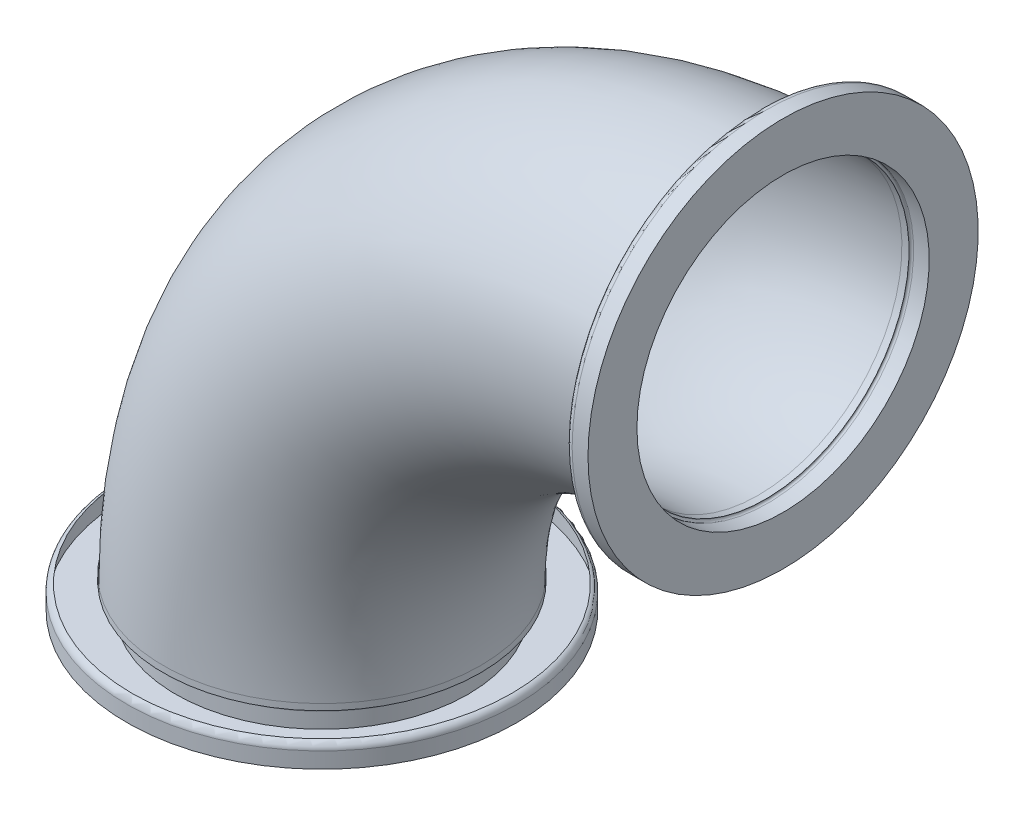
ISO-10303-21;
HEADER;
FILE_DESCRIPTION(('STEP AP214'),'2;1');
FILE_NAME('part.step','',(''),(''),'','','');
FILE_SCHEMA(('AUTOMOTIVE_DESIGN { 1 0 10303 214 1 1 1 1 }'));
ENDSEC;
DATA;
#1=APPLICATION_CONTEXT('core data for automotive mechanical design processes');
#2=APPLICATION_PROTOCOL_DEFINITION('international standard','automotive_design',2000,#1);
#3=PRODUCT_CONTEXT('',#1,'mechanical');
#4=PRODUCT('Part','Part','',(#3));
#5=PRODUCT_RELATED_PRODUCT_CATEGORY('part','',(#4));
#6=PRODUCT_DEFINITION_FORMATION('','',#4);
#7=PRODUCT_DEFINITION_CONTEXT('part definition',#1,'design');
#8=PRODUCT_DEFINITION('design','',#6,#7);
#9=PRODUCT_DEFINITION_SHAPE('','',#8);
#10=(LENGTH_UNIT() NAMED_UNIT(*) SI_UNIT(.MILLI.,.METRE.));
#11=(NAMED_UNIT(*) PLANE_ANGLE_UNIT() SI_UNIT($,.RADIAN.));
#12=(NAMED_UNIT(*) SI_UNIT($,.STERADIAN.) SOLID_ANGLE_UNIT());
#13=UNCERTAINTY_MEASURE_WITH_UNIT(LENGTH_MEASURE(1.E-05),#10,'distance_accuracy_value','');
#14=(GEOMETRIC_REPRESENTATION_CONTEXT(3) GLOBAL_UNCERTAINTY_ASSIGNED_CONTEXT((#13)) GLOBAL_UNIT_ASSIGNED_CONTEXT((#10,
#11,#12)) REPRESENTATION_CONTEXT('',''));
#15=CARTESIAN_POINT('',(0.,0.,0.));
#16=DIRECTION('',(0.,0.,1.));
#17=DIRECTION('',(1.,0.,0.));
#18=AXIS2_PLACEMENT_3D('',#15,#16,#17);
#19=CARTESIAN_POINT('',(-2.35922392732846E-13,61.5,0.));
#20=DIRECTION('',(1.,0.,0.));
#21=DIRECTION('',(0.,1.,0.));
#22=AXIS2_PLACEMENT_3D('',#19,#20,#21);
#23=PLANE('',#22);
#24=CARTESIAN_POINT('',(-2.35913423356498E-13,61.5,0.));
#25=DIRECTION('',(1.,0.,0.));
#26=DIRECTION('',(0.,0.,1.));
#27=AXIS2_PLACEMENT_3D('',#24,#25,#26);
#28=CIRCLE('',#27,22.25);
#29=CARTESIAN_POINT('',(-1.50562631979554E-13,39.25,0.));
#30=VERTEX_POINT('',#29);
#31=EDGE_CURVE('E123',#30,#30,#28,.T.);
#32=ORIENTED_EDGE('',*,*,#31,.T.);
#33=EDGE_LOOP('',(#32));
#34=FACE_BOUND('',#33,.T.);
#35=CARTESIAN_POINT('',(-2.35922392732846E-13,61.5,0.));
#36=DIRECTION('',(1.,0.,0.));
#37=DIRECTION('',(0.,0.,-1.));
#38=AXIS2_PLACEMENT_3D('',#35,#36,#37);
#39=CIRCLE('',#38,22.35);
#40=CARTESIAN_POINT('',(-2.35922392732846E-13,61.5,22.35));
#41=VERTEX_POINT('',#40);
#42=EDGE_CURVE('E203',#41,#41,#39,.T.);
#43=ORIENTED_EDGE('',*,*,#42,.F.);
#44=EDGE_LOOP('',(#43));
#45=FACE_BOUND('',#44,.T.);
#46=ADVANCED_FACE('F17',(#34,#45),#23,.F.);
#47=CARTESIAN_POINT('',(0.999999999999764,61.5,0.));
#48=DIRECTION('',(1.,0.,0.));
#49=DIRECTION('',(0.,1.,0.));
#50=AXIS2_PLACEMENT_3D('',#47,#48,#49);
#51=PLANE('',#50);
#52=CARTESIAN_POINT('',(0.999999999999764,61.5,0.));
#53=DIRECTION('',(1.,0.,0.));
#54=DIRECTION('',(0.,0.,-1.));
#55=AXIS2_PLACEMENT_3D('',#52,#53,#54);
#56=CIRCLE('',#55,20.25);
#57=CARTESIAN_POINT('',(0.999999999999764,61.5,20.25));
#58=VERTEX_POINT('',#57);
#59=EDGE_CURVE('E197',#58,#58,#56,.T.);
#60=ORIENTED_EDGE('',*,*,#59,.F.);
#61=EDGE_LOOP('',(#60));
#62=FACE_BOUND('',#61,.T.);
#63=CARTESIAN_POINT('',(0.999999999999764,61.5,0.));
#64=DIRECTION('',(1.,0.,0.));
#65=DIRECTION('',(0.,0.,-1.));
#66=AXIS2_PLACEMENT_3D('',#63,#64,#65);
#67=CIRCLE('',#66,20.3);
#68=CARTESIAN_POINT('',(0.999999999999764,61.5,20.3));
#69=VERTEX_POINT('',#68);
#70=EDGE_CURVE('E200',#69,#69,#67,.T.);
#71=ORIENTED_EDGE('',*,*,#70,.T.);
#72=EDGE_LOOP('',(#71));
#73=FACE_BOUND('',#72,.T.);
#74=ADVANCED_FACE('F323',(#62,#73),#51,.T.);
#75=CARTESIAN_POINT('',(3.49999999999976,61.5,0.));
#76=DIRECTION('',(-1.,0.,0.));
#77=DIRECTION('',(0.,1.,0.));
#78=AXIS2_PLACEMENT_3D('',#75,#76,#77);
#79=PLANE('',#78);
#80=CARTESIAN_POINT('',(3.49999999999976,61.5,0.));
#81=DIRECTION('',(1.,0.,0.));
#82=DIRECTION('',(0.,0.,-1.));
#83=AXIS2_PLACEMENT_3D('',#80,#81,#82);
#84=CIRCLE('',#83,20.6);
#85=CARTESIAN_POINT('',(3.49999999999976,61.5,20.6));
#86=VERTEX_POINT('',#85);
#87=EDGE_CURVE('E70',#86,#86,#84,.T.);
#88=ORIENTED_EDGE('',*,*,#87,.F.);
#89=EDGE_LOOP('',(#88));
#90=FACE_BOUND('',#89,.T.);
#91=CARTESIAN_POINT('',(3.49999999999976,61.5,0.));
#92=DIRECTION('',(-1.,0.,0.));
#93=DIRECTION('',(0.,0.,1.));
#94=AXIS2_PLACEMENT_3D('',#91,#92,#93);
#95=CIRCLE('',#94,27.5);
#96=CARTESIAN_POINT('',(3.49999999999976,61.5,27.5));
#97=VERTEX_POINT('',#96);
#98=EDGE_CURVE('E185',#97,#97,#95,.T.);
#99=ORIENTED_EDGE('',*,*,#98,.F.);
#100=EDGE_LOOP('',(#99));
#101=FACE_BOUND('',#100,.T.);
#102=ADVANCED_FACE('F328',(#90,#101),#79,.F.);
#103=CARTESIAN_POINT('',(-61.5,-1.,0.));
#104=DIRECTION('',(0.,-1.,0.));
#105=DIRECTION('',(0.,0.,-1.));
#106=AXIS2_PLACEMENT_3D('',#103,#104,#105);
#107=PLANE('',#106);
#108=CARTESIAN_POINT('',(-61.5,-1.,0.));
#109=DIRECTION('',(0.,-1.,0.));
#110=DIRECTION('',(-1.,0.,0.));
#111=AXIS2_PLACEMENT_3D('',#108,#109,#110);
#112=CIRCLE('',#111,20.25);
#113=CARTESIAN_POINT('',(-41.25,-1.,0.));
#114=VERTEX_POINT('',#113);
#115=EDGE_CURVE('E21',#114,#114,#112,.T.);
#116=ORIENTED_EDGE('',*,*,#115,.F.);
#117=EDGE_LOOP('',(#116));
#118=FACE_BOUND('',#117,.T.);
#119=CARTESIAN_POINT('',(-61.5,-1.,0.));
#120=DIRECTION('',(0.,-1.,0.));
#121=DIRECTION('',(-1.,0.,0.));
#122=AXIS2_PLACEMENT_3D('',#119,#120,#121);
#123=CIRCLE('',#122,20.3);
#124=CARTESIAN_POINT('',(-41.2,-1.,0.));
#125=VERTEX_POINT('',#124);
#126=EDGE_CURVE('E142',#125,#125,#123,.T.);
#127=ORIENTED_EDGE('',*,*,#126,.T.);
#128=EDGE_LOOP('',(#127));
#129=FACE_BOUND('',#128,.T.);
#130=ADVANCED_FACE('F292',(#118,#129),#107,.T.);
#131=CARTESIAN_POINT('',(-61.5,-3.5,0.));
#132=DIRECTION('',(0.,1.,0.));
#133=DIRECTION('',(0.,0.,-1.));
#134=AXIS2_PLACEMENT_3D('',#131,#132,#133);
#135=PLANE('',#134);
#136=CARTESIAN_POINT('',(-61.5,-3.5,0.));
#137=DIRECTION('',(0.,-1.,0.));
#138=DIRECTION('',(-1.,0.,0.));
#139=AXIS2_PLACEMENT_3D('',#136,#137,#138);
#140=CIRCLE('',#139,20.6);
#141=CARTESIAN_POINT('',(-40.9,-3.5,0.));
#142=VERTEX_POINT('',#141);
#143=EDGE_CURVE('E221',#142,#142,#140,.T.);
#144=ORIENTED_EDGE('',*,*,#143,.F.);
#145=EDGE_LOOP('',(#144));
#146=FACE_BOUND('',#145,.T.);
#147=CARTESIAN_POINT('',(-61.5,-3.5,0.));
#148=DIRECTION('',(0.,1.,0.));
#149=DIRECTION('',(1.,0.,0.));
#150=AXIS2_PLACEMENT_3D('',#147,#148,#149);
#151=CIRCLE('',#150,27.5);
#152=CARTESIAN_POINT('',(-34.,-3.5,0.));
#153=VERTEX_POINT('',#152);
#154=EDGE_CURVE('E28',#153,#153,#151,.T.);
#155=ORIENTED_EDGE('',*,*,#154,.F.);
#156=EDGE_LOOP('',(#155));
#157=FACE_BOUND('',#156,.T.);
#158=ADVANCED_FACE('F288',(#146,#157),#135,.F.);
#159=CARTESIAN_POINT('',(-61.5,0.,0.));
#160=DIRECTION('',(0.,-1.,0.));
#161=DIRECTION('',(0.,0.,-1.));
#162=AXIS2_PLACEMENT_3D('',#159,#160,#161);
#163=PLANE('',#162);
#164=CARTESIAN_POINT('',(-61.5,0.,0.));
#165=DIRECTION('',(0.,1.,0.));
#166=DIRECTION('',(0.,0.,-1.));
#167=AXIS2_PLACEMENT_3D('',#164,#165,#166);
#168=CIRCLE('',#167,22.25);
#169=CARTESIAN_POINT('',(-39.25,0.,0.));
#170=VERTEX_POINT('',#169);
#171=EDGE_CURVE('E180',#170,#170,#168,.T.);
#172=ORIENTED_EDGE('',*,*,#171,.F.);
#173=EDGE_LOOP('',(#172));
#174=FACE_BOUND('',#173,.T.);
#175=CARTESIAN_POINT('',(-61.5,0.,0.));
#176=DIRECTION('',(0.,-1.,0.));
#177=DIRECTION('',(-1.,0.,0.));
#178=AXIS2_PLACEMENT_3D('',#175,#176,#177);
#179=CIRCLE('',#178,22.35);
#180=CARTESIAN_POINT('',(-39.15,0.,0.));
#181=VERTEX_POINT('',#180);
#182=EDGE_CURVE('E135',#181,#181,#179,.T.);
#183=ORIENTED_EDGE('',*,*,#182,.F.);
#184=EDGE_LOOP('',(#183));
#185=FACE_BOUND('',#184,.T.);
#186=ADVANCED_FACE('F291',(#174,#185),#163,.F.);
#187=CARTESIAN_POINT('',(-61.5,-0.5,0.));
#188=DIRECTION('',(0.,-1.,0.));
#189=DIRECTION('',(-1.,0.,0.));
#190=AXIS2_PLACEMENT_3D('',#187,#188,#189);
#191=CYLINDRICAL_SURFACE('',#190,27.5);
#192=ORIENTED_EDGE('',*,*,#154,.T.);
#193=DIRECTION('',(0.,1.,0.));
#194=VECTOR('',#193,1.);
#195=CARTESIAN_POINT('',(-34.,-0.5,0.));
#196=LINE('',#195,#194);
#197=CARTESIAN_POINT('',(-34.,-1.26732698797896,0.));
#198=VERTEX_POINT('',#197);
#199=EDGE_CURVE('E11',#153,#198,#196,.T.);
#200=ORIENTED_EDGE('',*,*,#199,.T.);
#201=CARTESIAN_POINT('',(-61.5,-1.26732698797896,0.));
#202=DIRECTION('',(0.,-1.,0.));
#203=DIRECTION('',(-1.,0.,0.));
#204=AXIS2_PLACEMENT_3D('',#201,#202,#203);
#205=CIRCLE('',#204,27.5);
#206=EDGE_CURVE('E189',#198,#198,#205,.T.);
#207=ORIENTED_EDGE('',*,*,#206,.T.);
#208=ORIENTED_EDGE('',*,*,#199,.F.);
#209=EDGE_LOOP('',(#192,#200,#207,#208));
#210=FACE_BOUND('',#209,.T.);
#211=ADVANCED_FACE('F295',(#210),#191,.T.);
#212=CARTESIAN_POINT('',(-61.5,-993.131397208144,-1.20407684014293E-13));
#213=DIRECTION('',(0.,-1.,0.));
#214=DIRECTION('',(-1.,0.,0.));
#215=AXIS2_PLACEMENT_3D('',#212,#213,#214);
#216=CONICAL_SURFACE('',#215,3732.05080756897,1.30899693899575);
#217=CARTESIAN_POINT('',(-61.5,-0.301401161689893,0.));
#218=DIRECTION('',(0.,1.,0.));
#219=DIRECTION('',(1.,0.,0.));
#220=AXIS2_PLACEMENT_3D('',#217,#218,#219);
#221=CIRCLE('',#220,26.7588190451025);
#222=CARTESIAN_POINT('',(-34.7411809548975,-0.301401161689893,0.));
#223=VERTEX_POINT('',#222);
#224=EDGE_CURVE('E166',#223,#223,#221,.T.);
#225=ORIENTED_EDGE('',*,*,#224,.T.);
#226=DIRECTION('',(-0.96592582628907,0.258819045102514,0.));
#227=VECTOR('',#226,1.);
#228=CARTESIAN_POINT('',(3670.55080756897,-993.131397208144,3.36636723560171E-13));
#229=LINE('',#228,#227);
#230=CARTESIAN_POINT('',(-39.15,0.879938341020249,0.));
#231=VERTEX_POINT('',#230);
#232=EDGE_CURVE('E170',#223,#231,#229,.T.);
#233=ORIENTED_EDGE('',*,*,#232,.T.);
#234=CARTESIAN_POINT('',(-61.5,0.879938341020249,0.));
#235=DIRECTION('',(0.,-1.,0.));
#236=DIRECTION('',(-1.,0.,0.));
#237=AXIS2_PLACEMENT_3D('',#234,#235,#236);
#238=CIRCLE('',#237,22.35);
#239=EDGE_CURVE('E162',#231,#231,#238,.T.);
#240=ORIENTED_EDGE('',*,*,#239,.T.);
#241=ORIENTED_EDGE('',*,*,#232,.F.);
#242=EDGE_LOOP('',(#225,#233,#240,#241));
#243=FACE_BOUND('',#242,.T.);
#244=ADVANCED_FACE('F304',(#243),#216,.T.);
#245=CARTESIAN_POINT('',(-61.5,-1.26732698797896,0.));
#246=DIRECTION('',(0.,-1.,0.));
#247=DIRECTION('',(-1.,0.,0.));
#248=AXIS2_PLACEMENT_3D('',#245,#246,#247);
#249=TOROIDAL_SURFACE('',#248,26.5,1.);
#250=ORIENTED_EDGE('',*,*,#206,.F.);
#251=CARTESIAN_POINT('',(-35.,-1.26732698797896,0.));
#252=DIRECTION('',(0.,0.,1.));
#253=DIRECTION('',(1.,0.,0.));
#254=AXIS2_PLACEMENT_3D('',#251,#252,#253);
#255=CIRCLE('',#254,1.);
#256=EDGE_CURVE('E171',#198,#223,#255,.T.);
#257=ORIENTED_EDGE('',*,*,#256,.T.);
#258=ORIENTED_EDGE('',*,*,#224,.F.);
#259=ORIENTED_EDGE('',*,*,#256,.F.);
#260=EDGE_LOOP('',(#250,#257,#258,#259));
#261=FACE_BOUND('',#260,.T.);
#262=ADVANCED_FACE('F302',(#261),#249,.T.);
#263=CARTESIAN_POINT('',(-61.5,-1.,0.));
#264=DIRECTION('',(0.,-1.,0.));
#265=DIRECTION('',(-1.,0.,0.));
#266=AXIS2_PLACEMENT_3D('',#263,#264,#265);
#267=CYLINDRICAL_SURFACE('',#266,20.6);
#268=CARTESIAN_POINT('',(-61.5,-1.3,0.));
#269=DIRECTION('',(0.,1.,0.));
#270=DIRECTION('',(-1.,0.,0.));
#271=AXIS2_PLACEMENT_3D('',#268,#269,#270);
#272=CIRCLE('',#271,20.6);
#273=CARTESIAN_POINT('',(-40.9,-1.3,0.));
#274=VERTEX_POINT('',#273);
#275=EDGE_CURVE('E244',#274,#274,#272,.T.);
#276=ORIENTED_EDGE('',*,*,#275,.T.);
#277=DIRECTION('',(0.,-1.,0.));
#278=VECTOR('',#277,1.);
#279=CARTESIAN_POINT('',(-40.9,-1.,0.));
#280=LINE('',#279,#278);
#281=EDGE_CURVE('E252',#274,#142,#280,.T.);
#282=ORIENTED_EDGE('',*,*,#281,.T.);
#283=ORIENTED_EDGE('',*,*,#143,.T.);
#284=ORIENTED_EDGE('',*,*,#281,.F.);
#285=EDGE_LOOP('',(#276,#282,#283,#284));
#286=FACE_BOUND('',#285,.T.);
#287=ADVANCED_FACE('F284',(#286),#267,.F.);
#288=CARTESIAN_POINT('',(-61.5,-1.3,0.));
#289=DIRECTION('',(0.,-1.,0.));
#290=DIRECTION('',(-1.,0.,0.));
#291=AXIS2_PLACEMENT_3D('',#288,#289,#290);
#292=TOROIDAL_SURFACE('',#291,20.3,0.3);
#293=ORIENTED_EDGE('',*,*,#126,.F.);
#294=CARTESIAN_POINT('',(-41.2,-1.3,0.));
#295=DIRECTION('',(0.,0.,-1.));
#296=DIRECTION('',(1.,0.,0.));
#297=AXIS2_PLACEMENT_3D('',#294,#295,#296);
#298=CIRCLE('',#297,0.3);
#299=EDGE_CURVE('E237',#125,#274,#298,.T.);
#300=ORIENTED_EDGE('',*,*,#299,.T.);
#301=ORIENTED_EDGE('',*,*,#275,.F.);
#302=ORIENTED_EDGE('',*,*,#299,.F.);
#303=EDGE_LOOP('',(#293,#300,#301,#302));
#304=FACE_BOUND('',#303,.T.);
#305=ADVANCED_FACE('F337',(#304),#292,.F.);
#306=CARTESIAN_POINT('',(-61.5,6.86860279185569,0.));
#307=DIRECTION('',(0.,-1.,0.));
#308=DIRECTION('',(-1.,0.,0.));
#309=AXIS2_PLACEMENT_3D('',#306,#307,#308);
#310=CYLINDRICAL_SURFACE('',#309,20.25);
#311=CARTESIAN_POINT('',(-61.5,0.,0.));
#312=DIRECTION('',(0.,1.,0.));
#313=DIRECTION('',(-1.,0.,0.));
#314=AXIS2_PLACEMENT_3D('',#311,#312,#313);
#315=CIRCLE('',#314,20.25);
#316=CARTESIAN_POINT('',(-41.25,0.,0.));
#317=VERTEX_POINT('',#316);
#318=EDGE_CURVE('E132',#317,#317,#315,.T.);
#319=ORIENTED_EDGE('',*,*,#318,.T.);
#320=DIRECTION('',(0.,-1.,0.));
#321=VECTOR('',#320,1.);
#322=CARTESIAN_POINT('',(-41.25,6.86860279185569,0.));
#323=LINE('',#322,#321);
#324=EDGE_CURVE('E131',#317,#114,#323,.T.);
#325=ORIENTED_EDGE('',*,*,#324,.T.);
#326=ORIENTED_EDGE('',*,*,#115,.T.);
#327=ORIENTED_EDGE('',*,*,#324,.F.);
#328=EDGE_LOOP('',(#319,#325,#326,#327));
#329=FACE_BOUND('',#328,.T.);
#330=ADVANCED_FACE('F19',(#329),#310,.F.);
#331=CARTESIAN_POINT('',(-61.5,1.44263164512559,0.));
#332=DIRECTION('',(0.,-1.,0.));
#333=DIRECTION('',(-1.,0.,0.));
#334=AXIS2_PLACEMENT_3D('',#331,#332,#333);
#335=CYLINDRICAL_SURFACE('',#334,22.35);
#336=ORIENTED_EDGE('',*,*,#239,.F.);
#337=DIRECTION('',(0.,-1.,0.));
#338=VECTOR('',#337,1.);
#339=CARTESIAN_POINT('',(-39.15,1.44263164512559,0.));
#340=LINE('',#339,#338);
#341=EDGE_CURVE('E144',#231,#181,#340,.T.);
#342=ORIENTED_EDGE('',*,*,#341,.T.);
#343=ORIENTED_EDGE('',*,*,#182,.T.);
#344=ORIENTED_EDGE('',*,*,#341,.F.);
#345=EDGE_LOOP('',(#336,#342,#343,#344));
#346=FACE_BOUND('',#345,.T.);
#347=ADVANCED_FACE('F308',(#346),#335,.F.);
#348=CARTESIAN_POINT('',(0.999999999999764,61.5,0.));
#349=DIRECTION('',(1.,0.,0.));
#350=DIRECTION('',(0.,0.,-1.));
#351=AXIS2_PLACEMENT_3D('',#348,#349,#350);
#352=CYLINDRICAL_SURFACE('',#351,20.6);
#353=CARTESIAN_POINT('',(1.29999999999976,61.5,0.));
#354=DIRECTION('',(-1.,0.,0.));
#355=DIRECTION('',(0.,0.,-1.));
#356=AXIS2_PLACEMENT_3D('',#353,#354,#355);
#357=CIRCLE('',#356,20.6);
#358=CARTESIAN_POINT('',(1.29999999999976,61.5,20.6));
#359=VERTEX_POINT('',#358);
#360=EDGE_CURVE('E161',#359,#359,#357,.T.);
#361=ORIENTED_EDGE('',*,*,#360,.T.);
#362=DIRECTION('',(1.,0.,0.));
#363=VECTOR('',#362,1.);
#364=CARTESIAN_POINT('',(0.999999999999764,61.5,20.6));
#365=LINE('',#364,#363);
#366=EDGE_CURVE('E79',#359,#86,#365,.T.);
#367=ORIENTED_EDGE('',*,*,#366,.T.);
#368=ORIENTED_EDGE('',*,*,#87,.T.);
#369=ORIENTED_EDGE('',*,*,#366,.F.);
#370=EDGE_LOOP('',(#361,#367,#368,#369));
#371=FACE_BOUND('',#370,.T.);
#372=ADVANCED_FACE('F344',(#371),#352,.F.);
#373=CARTESIAN_POINT('',(1.29999999999976,61.5,0.));
#374=DIRECTION('',(1.,0.,0.));
#375=DIRECTION('',(0.,0.,-1.));
#376=AXIS2_PLACEMENT_3D('',#373,#374,#375);
#377=TOROIDAL_SURFACE('',#376,20.3,0.3);
#378=ORIENTED_EDGE('',*,*,#70,.F.);
#379=CARTESIAN_POINT('',(1.29999999999976,61.5,20.3));
#380=DIRECTION('',(0.,1.,0.));
#381=DIRECTION('',(0.,0.,1.));
#382=AXIS2_PLACEMENT_3D('',#379,#380,#381);
#383=CIRCLE('',#382,0.3);
#384=EDGE_CURVE('E148',#69,#359,#383,.T.);
#385=ORIENTED_EDGE('',*,*,#384,.T.);
#386=ORIENTED_EDGE('',*,*,#360,.F.);
#387=ORIENTED_EDGE('',*,*,#384,.F.);
#388=EDGE_LOOP('',(#378,#385,#386,#387));
#389=FACE_BOUND('',#388,.T.);
#390=ADVANCED_FACE('F347',(#389),#377,.F.);
#391=CARTESIAN_POINT('',(-6.86860279185592,61.5,0.));
#392=DIRECTION('',(1.,0.,0.));
#393=DIRECTION('',(0.,0.,-1.));
#394=AXIS2_PLACEMENT_3D('',#391,#392,#393);
#395=CYLINDRICAL_SURFACE('',#394,20.25);
#396=CARTESIAN_POINT('',(-2.35913423356498E-13,61.5,0.));
#397=DIRECTION('',(1.,0.,0.));
#398=DIRECTION('',(0.,1.,0.));
#399=AXIS2_PLACEMENT_3D('',#396,#397,#398);
#400=CIRCLE('',#399,20.25);
#401=CARTESIAN_POINT('',(-1.5823461322692E-13,41.25,0.));
#402=VERTEX_POINT('',#401);
#403=CARTESIAN_POINT('',(-2.36477504245158E-13,61.5,20.25));
#404=VERTEX_POINT('',#403);
#405=EDGE_CURVE('E192',#402,#404,#400,.T.);
#406=ORIENTED_EDGE('',*,*,#405,.F.);
#407=CARTESIAN_POINT('',(-2.35913423356498E-13,61.5,0.));
#408=DIRECTION('',(1.,0.,0.));
#409=DIRECTION('',(0.,1.,0.));
#410=AXIS2_PLACEMENT_3D('',#407,#408,#409);
#411=CIRCLE('',#410,20.25);
#412=EDGE_CURVE('E232',#404,#402,#411,.T.);
#413=ORIENTED_EDGE('',*,*,#412,.F.);
#414=DIRECTION('',(1.,0.,0.));
#415=VECTOR('',#414,1.);
#416=CARTESIAN_POINT('',(-6.86860279185592,61.5,20.25));
#417=LINE('',#416,#415);
#418=EDGE_CURVE('E184',#404,#58,#417,.T.);
#419=ORIENTED_EDGE('',*,*,#418,.T.);
#420=ORIENTED_EDGE('',*,*,#59,.T.);
#421=ORIENTED_EDGE('',*,*,#418,.F.);
#422=EDGE_LOOP('',(#406,#413,#419,#420,#421));
#423=FACE_BOUND('',#422,.T.);
#424=ADVANCED_FACE('F356',(#423),#395,.F.);
#425=CARTESIAN_POINT('',(0.499999999999764,61.5,0.));
#426=DIRECTION('',(1.,0.,0.));
#427=DIRECTION('',(0.,0.,-1.));
#428=AXIS2_PLACEMENT_3D('',#425,#426,#427);
#429=CYLINDRICAL_SURFACE('',#428,27.5);
#430=ORIENTED_EDGE('',*,*,#98,.T.);
#431=DIRECTION('',(-1.,0.,0.));
#432=VECTOR('',#431,1.);
#433=CARTESIAN_POINT('',(0.499999999999764,61.5,27.5));
#434=LINE('',#433,#432);
#435=CARTESIAN_POINT('',(1.26732698797873,61.5,27.5));
#436=VERTEX_POINT('',#435);
#437=EDGE_CURVE('E181',#97,#436,#434,.T.);
#438=ORIENTED_EDGE('',*,*,#437,.T.);
#439=CARTESIAN_POINT('',(1.26732698797873,61.5,0.));
#440=DIRECTION('',(1.,0.,0.));
#441=DIRECTION('',(0.,0.,-1.));
#442=AXIS2_PLACEMENT_3D('',#439,#440,#441);
#443=CIRCLE('',#442,27.5);
#444=EDGE_CURVE('E153',#436,#436,#443,.T.);
#445=ORIENTED_EDGE('',*,*,#444,.T.);
#446=ORIENTED_EDGE('',*,*,#437,.F.);
#447=EDGE_LOOP('',(#430,#438,#445,#446));
#448=FACE_BOUND('',#447,.T.);
#449=ADVANCED_FACE('F351',(#448),#429,.T.);
#450=CARTESIAN_POINT('',(1.26732698797873,61.5,0.));
#451=DIRECTION('',(1.,0.,0.));
#452=DIRECTION('',(0.,0.,-1.));
#453=AXIS2_PLACEMENT_3D('',#450,#451,#452);
#454=TOROIDAL_SURFACE('',#453,26.5,1.);
#455=ORIENTED_EDGE('',*,*,#444,.F.);
#456=CARTESIAN_POINT('',(1.26732698797873,61.5,26.5));
#457=DIRECTION('',(0.,-1.,0.));
#458=DIRECTION('',(0.,0.,1.));
#459=AXIS2_PLACEMENT_3D('',#456,#457,#458);
#460=CIRCLE('',#459,1.);
#461=CARTESIAN_POINT('',(0.301401161689654,61.5,26.7588190451028));
#462=VERTEX_POINT('',#461);
#463=EDGE_CURVE('E157',#436,#462,#460,.T.);
#464=ORIENTED_EDGE('',*,*,#463,.T.);
#465=CARTESIAN_POINT('',(0.301401161689658,61.5,0.));
#466=DIRECTION('',(-1.,0.,0.));
#467=DIRECTION('',(0.,0.,1.));
#468=AXIS2_PLACEMENT_3D('',#465,#466,#467);
#469=CIRCLE('',#468,26.7588190451025);
#470=EDGE_CURVE('E211',#462,#462,#469,.T.);
#471=ORIENTED_EDGE('',*,*,#470,.F.);
#472=ORIENTED_EDGE('',*,*,#463,.F.);
#473=EDGE_LOOP('',(#455,#464,#471,#472));
#474=FACE_BOUND('',#473,.T.);
#475=ADVANCED_FACE('F342',(#474),#454,.T.);
#476=CARTESIAN_POINT('',(993.131397208144,61.5000000000038,0.));
#477=DIRECTION('',(1.,0.,0.));
#478=DIRECTION('',(0.,0.,-1.));
#479=AXIS2_PLACEMENT_3D('',#476,#477,#478);
#480=CONICAL_SURFACE('',#479,3732.05080756897,1.30899693899575);
#481=ORIENTED_EDGE('',*,*,#470,.T.);
#482=DIRECTION('',(-0.258819045102514,0.,-0.96592582628907));
#483=VECTOR('',#482,1.);
#484=CARTESIAN_POINT('',(993.131397208144,61.5000000000031,3732.05080756897));
#485=LINE('',#484,#483);
#486=CARTESIAN_POINT('',(-0.879938341020485,61.5,22.35));
#487=VERTEX_POINT('',#486);
#488=EDGE_CURVE('E158',#462,#487,#485,.T.);
#489=ORIENTED_EDGE('',*,*,#488,.T.);
#490=CARTESIAN_POINT('',(-0.879938341020485,61.5,0.));
#491=DIRECTION('',(1.,0.,0.));
#492=DIRECTION('',(0.,0.,-1.));
#493=AXIS2_PLACEMENT_3D('',#490,#491,#492);
#494=CIRCLE('',#493,22.35);
#495=EDGE_CURVE('E152',#487,#487,#494,.T.);
#496=ORIENTED_EDGE('',*,*,#495,.T.);
#497=ORIENTED_EDGE('',*,*,#488,.F.);
#498=EDGE_LOOP('',(#481,#489,#496,#497));
#499=FACE_BOUND('',#498,.T.);
#500=ADVANCED_FACE('F338',(#499),#480,.T.);
#501=CARTESIAN_POINT('',(-1.44263164512583,61.5,0.));
#502=DIRECTION('',(1.,0.,0.));
#503=DIRECTION('',(0.,0.,-1.));
#504=AXIS2_PLACEMENT_3D('',#501,#502,#503);
#505=CYLINDRICAL_SURFACE('',#504,22.35);
#506=ORIENTED_EDGE('',*,*,#495,.F.);
#507=DIRECTION('',(1.,0.,0.));
#508=VECTOR('',#507,1.);
#509=CARTESIAN_POINT('',(-1.44263164512583,61.5,22.35));
#510=LINE('',#509,#508);
#511=EDGE_CURVE('E196',#487,#41,#510,.T.);
#512=ORIENTED_EDGE('',*,*,#511,.T.);
#513=ORIENTED_EDGE('',*,*,#42,.T.);
#514=ORIENTED_EDGE('',*,*,#511,.F.);
#515=EDGE_LOOP('',(#506,#512,#513,#514));
#516=FACE_BOUND('',#515,.T.);
#517=ADVANCED_FACE('F341',(#516),#505,.F.);
#518=CARTESIAN_POINT('',(0.,0.,0.));
#519=DIRECTION('',(0.,0.,1.));
#520=DIRECTION('',(1.,0.,0.));
#521=AXIS2_PLACEMENT_3D('',#518,#519,#520);
#522=TOROIDAL_SURFACE('',#521,61.5,20.25);
#523=ORIENTED_EDGE('',*,*,#405,.T.);
#524=ORIENTED_EDGE('',*,*,#412,.T.);
#525=CARTESIAN_POINT('',(0.,0.,0.));
#526=DIRECTION('',(0.,0.,1.));
#527=DIRECTION('',(1.,0.,0.));
#528=AXIS2_PLACEMENT_3D('',#525,#526,#527);
#529=CIRCLE('',#528,41.25);
#530=EDGE_CURVE('E114',#402,#317,#529,.T.);
#531=ORIENTED_EDGE('',*,*,#530,.T.);
#532=ORIENTED_EDGE('',*,*,#318,.F.);
#533=ORIENTED_EDGE('',*,*,#530,.F.);
#534=EDGE_LOOP('',(#523,#524,#531,#532,#533));
#535=FACE_BOUND('',#534,.T.);
#536=ADVANCED_FACE('F483',(#535),#522,.F.);
#537=CARTESIAN_POINT('',(0.,0.,0.));
#538=DIRECTION('',(0.,0.,1.));
#539=DIRECTION('',(1.,0.,0.));
#540=AXIS2_PLACEMENT_3D('',#537,#538,#539);
#541=TOROIDAL_SURFACE('',#540,61.5,22.25);
#542=ORIENTED_EDGE('',*,*,#171,.T.);
#543=CARTESIAN_POINT('',(0.,0.,0.));
#544=DIRECTION('',(0.,0.,-1.));
#545=DIRECTION('',(1.,0.,0.));
#546=AXIS2_PLACEMENT_3D('',#543,#544,#545);
#547=CIRCLE('',#546,39.25);
#548=EDGE_CURVE('E176',#170,#30,#547,.T.);
#549=ORIENTED_EDGE('',*,*,#548,.T.);
#550=ORIENTED_EDGE('',*,*,#31,.F.);
#551=ORIENTED_EDGE('',*,*,#548,.F.);
#552=EDGE_LOOP('',(#542,#549,#550,#551));
#553=FACE_BOUND('',#552,.T.);
#554=ADVANCED_FACE('F429',(#553),#541,.T.);
#555=CLOSED_SHELL('',(#46,#74,#102,#130,#158,#186,#211,#244,#262,#287,#305,#330,#347,#372,#390,
#424,#449,#475,#500,#517,#536,#554));
#556=MANIFOLD_SOLID_BREP('B1',#555);
#557=ADVANCED_BREP_SHAPE_REPRESENTATION('',(#18,#556),#14);
#558=SHAPE_DEFINITION_REPRESENTATION(#9,#557);
ENDSEC;
END-ISO-10303-21;
